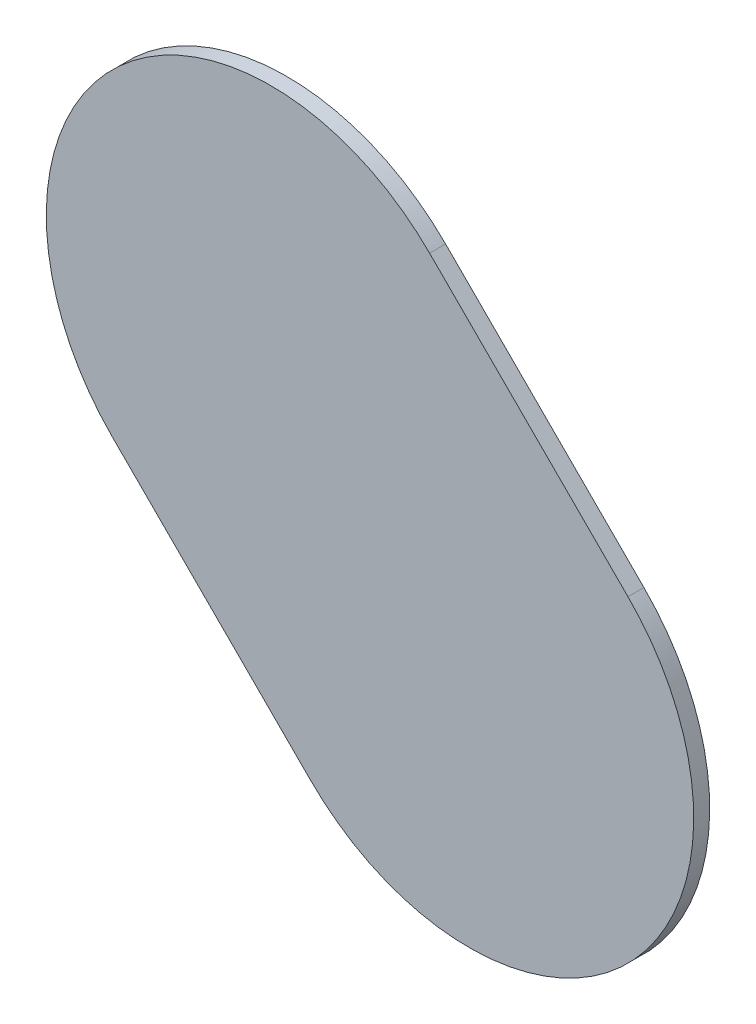
ISO-10303-21;
HEADER;
FILE_DESCRIPTION(('STEP AP214'),'2;1');
FILE_NAME('part.step','',(''),(''),'','','');
FILE_SCHEMA(('AUTOMOTIVE_DESIGN { 1 0 10303 214 1 1 1 1 }'));
ENDSEC;
DATA;
#1=APPLICATION_CONTEXT('core data for automotive mechanical design processes');
#2=APPLICATION_PROTOCOL_DEFINITION('international standard','automotive_design',2000,#1);
#3=PRODUCT_CONTEXT('',#1,'mechanical');
#4=PRODUCT('Part','Part','',(#3));
#5=PRODUCT_RELATED_PRODUCT_CATEGORY('part','',(#4));
#6=PRODUCT_DEFINITION_FORMATION('','',#4);
#7=PRODUCT_DEFINITION_CONTEXT('part definition',#1,'design');
#8=PRODUCT_DEFINITION('design','',#6,#7);
#9=PRODUCT_DEFINITION_SHAPE('','',#8);
#10=(LENGTH_UNIT() NAMED_UNIT(*) SI_UNIT(.MILLI.,.METRE.));
#11=(NAMED_UNIT(*) PLANE_ANGLE_UNIT() SI_UNIT($,.RADIAN.));
#12=(NAMED_UNIT(*) SI_UNIT($,.STERADIAN.) SOLID_ANGLE_UNIT());
#13=UNCERTAINTY_MEASURE_WITH_UNIT(LENGTH_MEASURE(1.E-05),#10,'distance_accuracy_value','');
#14=(GEOMETRIC_REPRESENTATION_CONTEXT(3) GLOBAL_UNCERTAINTY_ASSIGNED_CONTEXT((#13)) GLOBAL_UNIT_ASSIGNED_CONTEXT((#10,
#11,#12)) REPRESENTATION_CONTEXT('',''));
#15=CARTESIAN_POINT('',(0.,0.,0.));
#16=DIRECTION('',(0.,0.,1.));
#17=DIRECTION('',(1.,0.,0.));
#18=AXIS2_PLACEMENT_3D('',#15,#16,#17);
#19=CARTESIAN_POINT('',(48.81978044,118.17844284,0.));
#20=DIRECTION('',(0.707106781186542,0.707106781186553,0.));
#21=DIRECTION('',(0.707106781186553,-0.707106781186542,0.));
#22=AXIS2_PLACEMENT_3D('',#19,#20,#21);
#23=PLANE('',#22);
#24=DIRECTION('',(0.707106781186553,-0.707106781186542,0.));
#25=VECTOR('',#24,1.);
#26=CARTESIAN_POINT('',(48.81978044,118.17844284,0.03556));
#27=LINE('',#26,#25);
#28=CARTESIAN_POINT('',(48.81978044,118.17844284,0.03556));
#29=VERTEX_POINT('',#28);
#30=CARTESIAN_POINT('',(49.26143564,117.73678764,0.03556));
#31=VERTEX_POINT('',#30);
#32=EDGE_CURVE('E11',#29,#31,#27,.T.);
#33=ORIENTED_EDGE('',*,*,#32,.F.);
#34=DIRECTION('',(0.,0.,1.));
#35=VECTOR('',#34,1.);
#36=CARTESIAN_POINT('',(48.81978044,118.17844284,0.));
#37=LINE('',#36,#35);
#38=CARTESIAN_POINT('',(48.81978044,118.17844284,0.));
#39=VERTEX_POINT('',#38);
#40=EDGE_CURVE('E24',#39,#29,#37,.T.);
#41=ORIENTED_EDGE('',*,*,#40,.F.);
#42=DIRECTION('',(0.707106781186553,-0.707106781186542,0.));
#43=VECTOR('',#42,1.);
#44=CARTESIAN_POINT('',(48.81978044,118.17844284,0.));
#45=LINE('',#44,#43);
#46=CARTESIAN_POINT('',(49.26143564,117.73678764,0.));
#47=VERTEX_POINT('',#46);
#48=EDGE_CURVE('E75',#39,#47,#45,.T.);
#49=ORIENTED_EDGE('',*,*,#48,.T.);
#50=DIRECTION('',(0.,0.,1.));
#51=VECTOR('',#50,1.);
#52=CARTESIAN_POINT('',(49.26143564,117.73678764,0.));
#53=LINE('',#52,#51);
#54=EDGE_CURVE('E37',#47,#31,#53,.T.);
#55=ORIENTED_EDGE('',*,*,#54,.T.);
#56=EDGE_LOOP('',(#33,#41,#49,#55));
#57=FACE_BOUND('',#56,.T.);
#58=ADVANCED_FACE('F17',(#57),#23,.F.);
#59=CARTESIAN_POINT('',(49.6149884,118.0903404,0.));
#60=DIRECTION('',(0.,0.,-1.));
#61=DIRECTION('',(-0.707106781186533,-0.707106781186562,0.));
#62=AXIS2_PLACEMENT_3D('',#59,#60,#61);
#63=CYLINDRICAL_SURFACE('',#62,0.499999108206446);
#64=CARTESIAN_POINT('',(49.6149884,118.0903404,0.03556));
#65=DIRECTION('',(0.,0.,1.));
#66=DIRECTION('',(-0.707106781186533,-0.707106781186562,0.));
#67=AXIS2_PLACEMENT_3D('',#64,#65,#66);
#68=CIRCLE('',#67,0.499999108206446);
#69=CARTESIAN_POINT('',(49.96854116,118.44389316,0.03556));
#70=VERTEX_POINT('',#69);
#71=EDGE_CURVE('E83',#31,#70,#68,.T.);
#72=ORIENTED_EDGE('',*,*,#71,.F.);
#73=ORIENTED_EDGE('',*,*,#54,.F.);
#74=CARTESIAN_POINT('',(49.6149884,118.0903404,0.));
#75=DIRECTION('',(0.,0.,1.));
#76=DIRECTION('',(-0.707106781186533,-0.707106781186562,0.));
#77=AXIS2_PLACEMENT_3D('',#74,#75,#76);
#78=CIRCLE('',#77,0.499999108206446);
#79=CARTESIAN_POINT('',(49.96854116,118.44389316,0.));
#80=VERTEX_POINT('',#79);
#81=EDGE_CURVE('E81',#47,#80,#78,.T.);
#82=ORIENTED_EDGE('',*,*,#81,.T.);
#83=DIRECTION('',(0.,0.,1.));
#84=VECTOR('',#83,1.);
#85=CARTESIAN_POINT('',(49.96854116,118.44389316,0.));
#86=LINE('',#85,#84);
#87=EDGE_CURVE('E67',#80,#70,#86,.T.);
#88=ORIENTED_EDGE('',*,*,#87,.T.);
#89=EDGE_LOOP('',(#72,#73,#82,#88));
#90=FACE_BOUND('',#89,.T.);
#91=ADVANCED_FACE('F89',(#90),#63,.T.);
#92=CARTESIAN_POINT('',(49.96854116,118.44389316,0.));
#93=DIRECTION('',(-0.70710678118653,-0.707106781186565,0.));
#94=DIRECTION('',(-0.707106781186565,0.70710678118653,0.));
#95=AXIS2_PLACEMENT_3D('',#92,#93,#94);
#96=PLANE('',#95);
#97=DIRECTION('',(-0.707106781186565,0.70710678118653,0.));
#98=VECTOR('',#97,1.);
#99=CARTESIAN_POINT('',(49.96854116,118.44389316,0.03556));
#100=LINE('',#99,#98);
#101=CARTESIAN_POINT('',(49.52688596,118.88554836,0.03556));
#102=VERTEX_POINT('',#101);
#103=EDGE_CURVE('E71',#70,#102,#100,.T.);
#104=ORIENTED_EDGE('',*,*,#103,.F.);
#105=ORIENTED_EDGE('',*,*,#87,.F.);
#106=DIRECTION('',(-0.707106781186565,0.70710678118653,0.));
#107=VECTOR('',#106,1.);
#108=CARTESIAN_POINT('',(49.96854116,118.44389316,0.));
#109=LINE('',#108,#107);
#110=CARTESIAN_POINT('',(49.52688596,118.88554836,0.));
#111=VERTEX_POINT('',#110);
#112=EDGE_CURVE('E63',#80,#111,#109,.T.);
#113=ORIENTED_EDGE('',*,*,#112,.T.);
#114=DIRECTION('',(0.,0.,1.));
#115=VECTOR('',#114,1.);
#116=CARTESIAN_POINT('',(49.52688596,118.88554836,0.));
#117=LINE('',#116,#115);
#118=EDGE_CURVE('E53',#111,#102,#117,.T.);
#119=ORIENTED_EDGE('',*,*,#118,.T.);
#120=EDGE_LOOP('',(#104,#105,#113,#119));
#121=FACE_BOUND('',#120,.T.);
#122=ADVANCED_FACE('F66',(#121),#96,.F.);
#123=CARTESIAN_POINT('',(49.1733332,118.5319956,0.));
#124=DIRECTION('',(0.,0.,-1.));
#125=DIRECTION('',(0.707106781186548,0.707106781186548,0.));
#126=AXIS2_PLACEMENT_3D('',#123,#124,#125);
#127=CYLINDRICAL_SURFACE('',#126,0.499999108206439);
#128=CARTESIAN_POINT('',(49.1733332,118.5319956,0.03556));
#129=DIRECTION('',(0.,0.,1.));
#130=DIRECTION('',(0.707106781186548,0.707106781186548,0.));
#131=AXIS2_PLACEMENT_3D('',#128,#129,#130);
#132=CIRCLE('',#131,0.499999108206439);
#133=EDGE_CURVE('E59',#102,#29,#132,.T.);
#134=ORIENTED_EDGE('',*,*,#133,.F.);
#135=ORIENTED_EDGE('',*,*,#118,.F.);
#136=CARTESIAN_POINT('',(49.1733332,118.5319956,0.));
#137=DIRECTION('',(0.,0.,1.));
#138=DIRECTION('',(0.707106781186548,0.707106781186548,0.));
#139=AXIS2_PLACEMENT_3D('',#136,#137,#138);
#140=CIRCLE('',#139,0.499999108206439);
#141=EDGE_CURVE('E57',#111,#39,#140,.T.);
#142=ORIENTED_EDGE('',*,*,#141,.T.);
#143=ORIENTED_EDGE('',*,*,#40,.T.);
#144=EDGE_LOOP('',(#134,#135,#142,#143));
#145=FACE_BOUND('',#144,.T.);
#146=ADVANCED_FACE('F55',(#145),#127,.T.);
#147=CARTESIAN_POINT('',(48.81978044,118.17844284,0.));
#148=DIRECTION('',(0.,0.,-1.));
#149=DIRECTION('',(-1.,0.,0.));
#150=AXIS2_PLACEMENT_3D('',#147,#148,#149);
#151=PLANE('',#150);
#152=ORIENTED_EDGE('',*,*,#141,.F.);
#153=ORIENTED_EDGE('',*,*,#112,.F.);
#154=ORIENTED_EDGE('',*,*,#81,.F.);
#155=ORIENTED_EDGE('',*,*,#48,.F.);
#156=EDGE_LOOP('',(#152,#153,#154,#155));
#157=FACE_BOUND('',#156,.T.);
#158=ADVANCED_FACE('F74',(#157),#151,.T.);
#159=CARTESIAN_POINT('',(48.81978044,118.17844284,0.03556));
#160=DIRECTION('',(0.,0.,-1.));
#161=DIRECTION('',(-1.,0.,0.));
#162=AXIS2_PLACEMENT_3D('',#159,#160,#161);
#163=PLANE('',#162);
#164=ORIENTED_EDGE('',*,*,#32,.T.);
#165=ORIENTED_EDGE('',*,*,#71,.T.);
#166=ORIENTED_EDGE('',*,*,#103,.T.);
#167=ORIENTED_EDGE('',*,*,#133,.T.);
#168=EDGE_LOOP('',(#164,#165,#166,#167));
#169=FACE_BOUND('',#168,.T.);
#170=ADVANCED_FACE('F91',(#169),#163,.F.);
#171=CLOSED_SHELL('',(#58,#91,#122,#146,#158,#170));
#172=MANIFOLD_SOLID_BREP('B1',#171);
#173=ADVANCED_BREP_SHAPE_REPRESENTATION('',(#18,#172),#14);
#174=SHAPE_DEFINITION_REPRESENTATION(#9,#173);
ENDSEC;
END-ISO-10303-21;
